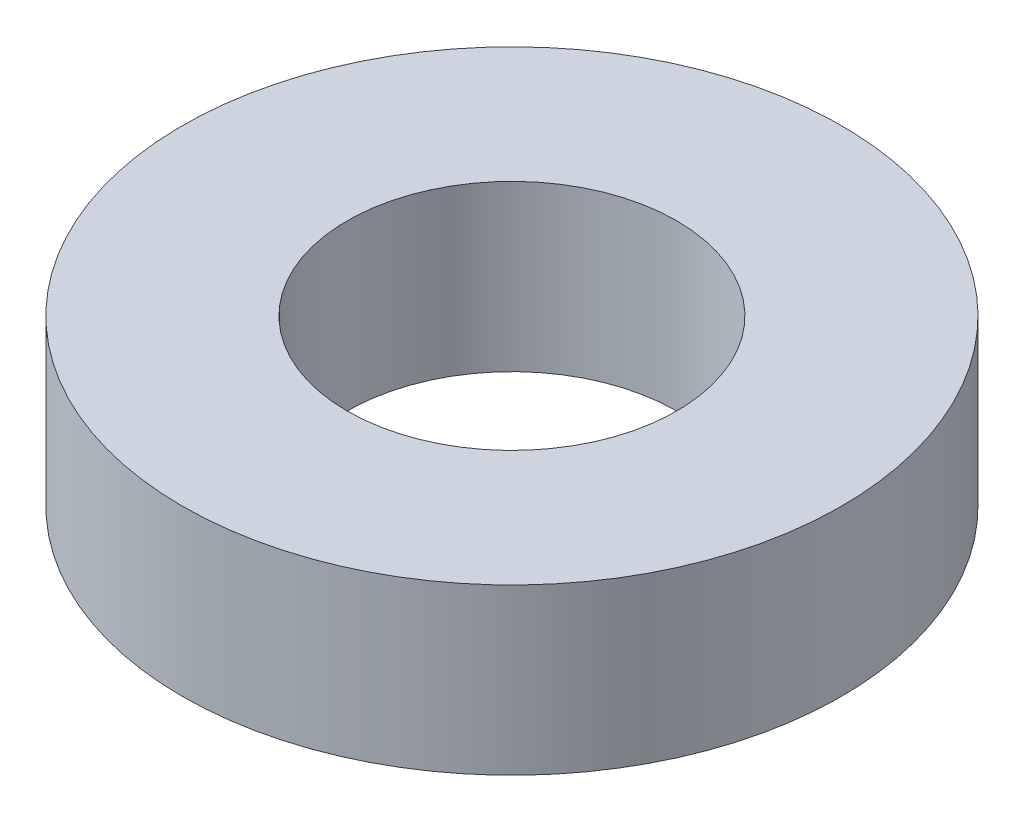
ISO-10303-21;
HEADER;
FILE_DESCRIPTION(('STEP AP214'),'2;1');
FILE_NAME('part.step','',(''),(''),'','','');
FILE_SCHEMA(('AUTOMOTIVE_DESIGN { 1 0 10303 214 1 1 1 1 }'));
ENDSEC;
DATA;
#1=APPLICATION_CONTEXT('core data for automotive mechanical design processes');
#2=APPLICATION_PROTOCOL_DEFINITION('international standard','automotive_design',2000,#1);
#3=PRODUCT_CONTEXT('',#1,'mechanical');
#4=PRODUCT('Part','Part','',(#3));
#5=PRODUCT_RELATED_PRODUCT_CATEGORY('part','',(#4));
#6=PRODUCT_DEFINITION_FORMATION('','',#4);
#7=PRODUCT_DEFINITION_CONTEXT('part definition',#1,'design');
#8=PRODUCT_DEFINITION('design','',#6,#7);
#9=PRODUCT_DEFINITION_SHAPE('','',#8);
#10=(LENGTH_UNIT() NAMED_UNIT(*) SI_UNIT(.MILLI.,.METRE.));
#11=(NAMED_UNIT(*) PLANE_ANGLE_UNIT() SI_UNIT($,.RADIAN.));
#12=(NAMED_UNIT(*) SI_UNIT($,.STERADIAN.) SOLID_ANGLE_UNIT());
#13=UNCERTAINTY_MEASURE_WITH_UNIT(LENGTH_MEASURE(1.E-05),#10,'distance_accuracy_value','');
#14=(GEOMETRIC_REPRESENTATION_CONTEXT(3) GLOBAL_UNCERTAINTY_ASSIGNED_CONTEXT((#13)) GLOBAL_UNIT_ASSIGNED_CONTEXT((#10,
#11,#12)) REPRESENTATION_CONTEXT('',''));
#15=CARTESIAN_POINT('',(0.,0.,0.));
#16=DIRECTION('',(0.,0.,1.));
#17=DIRECTION('',(1.,0.,0.));
#18=AXIS2_PLACEMENT_3D('',#15,#16,#17);
#19=CARTESIAN_POINT('',(0.,1.5,0.));
#20=DIRECTION('',(0.,1.,0.));
#21=DIRECTION('',(0.,0.,1.));
#22=AXIS2_PLACEMENT_3D('',#19,#20,#21);
#23=PLANE('',#22);
#24=CARTESIAN_POINT('',(0.,1.5,0.));
#25=DIRECTION('',(0.,1.,0.));
#26=DIRECTION('',(0.,0.,1.));
#27=AXIS2_PLACEMENT_3D('',#24,#25,#26);
#28=CIRCLE('',#27,6.);
#29=CARTESIAN_POINT('',(0.,1.5,6.));
#30=VERTEX_POINT('',#29);
#31=EDGE_CURVE('E10',#30,#30,#28,.T.);
#32=ORIENTED_EDGE('',*,*,#31,.T.);
#33=EDGE_LOOP('',(#32));
#34=FACE_BOUND('',#33,.T.);
#35=CARTESIAN_POINT('',(0.,1.5,0.));
#36=DIRECTION('',(0.,1.,0.));
#37=DIRECTION('',(0.,0.,1.));
#38=AXIS2_PLACEMENT_3D('',#35,#36,#37);
#39=CIRCLE('',#38,3.);
#40=CARTESIAN_POINT('',(0.,1.5,3.));
#41=VERTEX_POINT('',#40);
#42=EDGE_CURVE('E48',#41,#41,#39,.T.);
#43=ORIENTED_EDGE('',*,*,#42,.F.);
#44=EDGE_LOOP('',(#43));
#45=FACE_BOUND('',#44,.T.);
#46=ADVANCED_FACE('F40',(#34,#45),#23,.T.);
#47=CARTESIAN_POINT('',(0.,-1.5,0.));
#48=DIRECTION('',(0.,1.,0.));
#49=DIRECTION('',(0.,0.,1.));
#50=AXIS2_PLACEMENT_3D('',#47,#48,#49);
#51=PLANE('',#50);
#52=CARTESIAN_POINT('',(0.,-1.5,0.));
#53=DIRECTION('',(0.,1.,0.));
#54=DIRECTION('',(0.,0.,1.));
#55=AXIS2_PLACEMENT_3D('',#52,#53,#54);
#56=CIRCLE('',#55,6.);
#57=CARTESIAN_POINT('',(0.,-1.5,6.));
#58=VERTEX_POINT('',#57);
#59=EDGE_CURVE('E41',#58,#58,#56,.T.);
#60=ORIENTED_EDGE('',*,*,#59,.F.);
#61=EDGE_LOOP('',(#60));
#62=FACE_BOUND('',#61,.T.);
#63=CARTESIAN_POINT('',(0.,-1.5,0.));
#64=DIRECTION('',(0.,1.,0.));
#65=DIRECTION('',(0.,0.,1.));
#66=AXIS2_PLACEMENT_3D('',#63,#64,#65);
#67=CIRCLE('',#66,3.);
#68=CARTESIAN_POINT('',(0.,-1.5,3.));
#69=VERTEX_POINT('',#68);
#70=EDGE_CURVE('E49',#69,#69,#67,.T.);
#71=ORIENTED_EDGE('',*,*,#70,.T.);
#72=EDGE_LOOP('',(#71));
#73=FACE_BOUND('',#72,.T.);
#74=ADVANCED_FACE('F58',(#62,#73),#51,.F.);
#75=CARTESIAN_POINT('',(0.,1.5,0.));
#76=DIRECTION('',(0.,-1.,0.));
#77=DIRECTION('',(0.,0.,-1.));
#78=AXIS2_PLACEMENT_3D('',#75,#76,#77);
#79=CYLINDRICAL_SURFACE('',#78,6.);
#80=ORIENTED_EDGE('',*,*,#31,.F.);
#81=EDGE_LOOP('',(#80));
#82=FACE_BOUND('',#81,.T.);
#83=ORIENTED_EDGE('',*,*,#59,.T.);
#84=EDGE_LOOP('',(#83));
#85=FACE_BOUND('',#84,.T.);
#86=ADVANCED_FACE('F39',(#82,#85),#79,.T.);
#87=CARTESIAN_POINT('',(0.,1.5,0.));
#88=DIRECTION('',(0.,-1.,0.));
#89=DIRECTION('',(0.,0.,-1.));
#90=AXIS2_PLACEMENT_3D('',#87,#88,#89);
#91=CYLINDRICAL_SURFACE('',#90,3.);
#92=ORIENTED_EDGE('',*,*,#42,.T.);
#93=EDGE_LOOP('',(#92));
#94=FACE_BOUND('',#93,.T.);
#95=ORIENTED_EDGE('',*,*,#70,.F.);
#96=EDGE_LOOP('',(#95));
#97=FACE_BOUND('',#96,.T.);
#98=ADVANCED_FACE('F57',(#94,#97),#91,.F.);
#99=CLOSED_SHELL('',(#46,#74,#86,#98));
#100=MANIFOLD_SOLID_BREP('B2',#99);
#101=ADVANCED_BREP_SHAPE_REPRESENTATION('',(#18,#100),#14);
#102=SHAPE_DEFINITION_REPRESENTATION(#9,#101);
ENDSEC;
END-ISO-10303-21;
